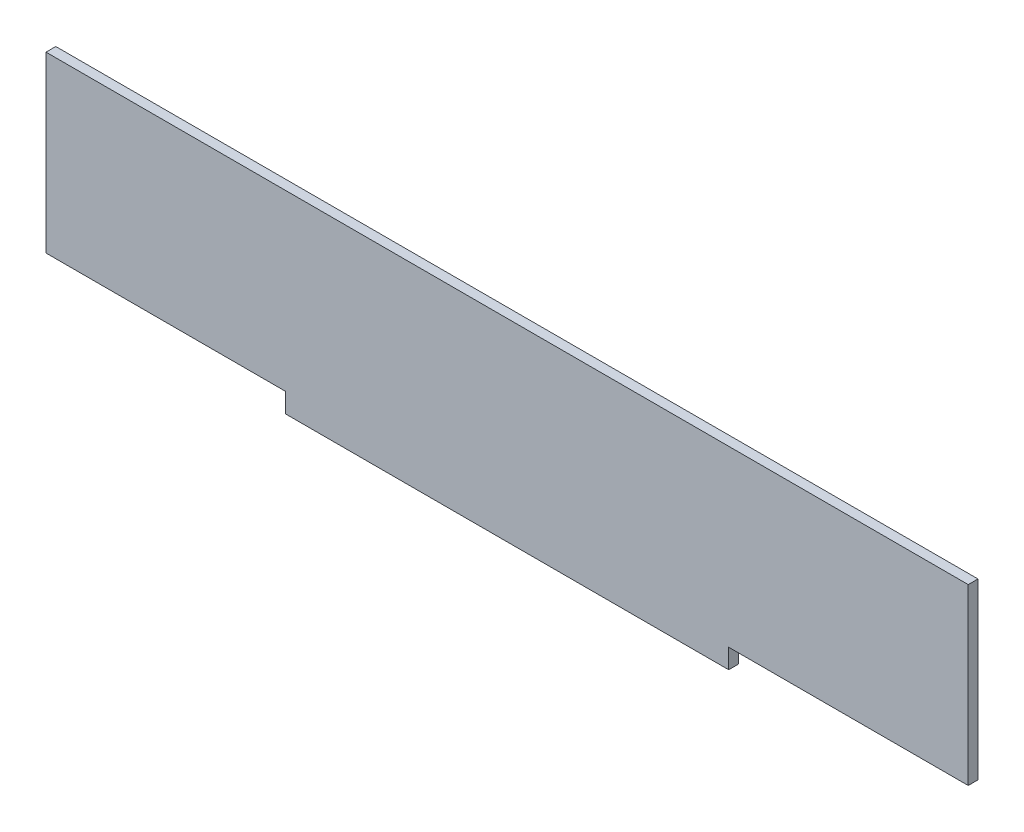
ISO-10303-21;
HEADER;
FILE_DESCRIPTION(('STEP AP214'),'2;1');
FILE_NAME('part.step','',(''),(''),'','','');
FILE_SCHEMA(('AUTOMOTIVE_DESIGN { 1 0 10303 214 1 1 1 1 }'));
ENDSEC;
DATA;
#1=APPLICATION_CONTEXT('core data for automotive mechanical design processes');
#2=APPLICATION_PROTOCOL_DEFINITION('international standard','automotive_design',2000,#1);
#3=PRODUCT_CONTEXT('',#1,'mechanical');
#4=PRODUCT('Part','Part','',(#3));
#5=PRODUCT_RELATED_PRODUCT_CATEGORY('part','',(#4));
#6=PRODUCT_DEFINITION_FORMATION('','',#4);
#7=PRODUCT_DEFINITION_CONTEXT('part definition',#1,'design');
#8=PRODUCT_DEFINITION('design','',#6,#7);
#9=PRODUCT_DEFINITION_SHAPE('','',#8);
#10=(LENGTH_UNIT() NAMED_UNIT(*) SI_UNIT(.MILLI.,.METRE.));
#11=(NAMED_UNIT(*) PLANE_ANGLE_UNIT() SI_UNIT($,.RADIAN.));
#12=(NAMED_UNIT(*) SI_UNIT($,.STERADIAN.) SOLID_ANGLE_UNIT());
#13=UNCERTAINTY_MEASURE_WITH_UNIT(LENGTH_MEASURE(1.E-05),#10,'distance_accuracy_value','');
#14=(GEOMETRIC_REPRESENTATION_CONTEXT(3) GLOBAL_UNCERTAINTY_ASSIGNED_CONTEXT((#13)) GLOBAL_UNIT_ASSIGNED_CONTEXT((#10,
#11,#12)) REPRESENTATION_CONTEXT('',''));
#15=CARTESIAN_POINT('',(0.,0.,0.));
#16=DIRECTION('',(0.,0.,1.));
#17=DIRECTION('',(1.,0.,0.));
#18=AXIS2_PLACEMENT_3D('',#15,#16,#17);
#19=CARTESIAN_POINT('',(-149.85,-28.275,3.175));
#20=DIRECTION('',(0.,1.,0.));
#21=DIRECTION('',(0.,0.,1.));
#22=AXIS2_PLACEMENT_3D('',#19,#20,#21);
#23=PLANE('',#22);
#24=DIRECTION('',(0.,0.,1.));
#25=VECTOR('',#24,1.);
#26=CARTESIAN_POINT('',(72.,-28.275,3.175));
#27=LINE('',#26,#25);
#28=CARTESIAN_POINT('',(72.,-28.275,0.));
#29=VERTEX_POINT('',#28);
#30=CARTESIAN_POINT('',(72.,-28.275,3.175));
#31=VERTEX_POINT('',#30);
#32=EDGE_CURVE('E131',#29,#31,#27,.T.);
#33=ORIENTED_EDGE('',*,*,#32,.F.);
#34=DIRECTION('',(1.,0.,0.));
#35=VECTOR('',#34,1.);
#36=CARTESIAN_POINT('',(-149.85,-28.275,0.));
#37=LINE('',#36,#35);
#38=CARTESIAN_POINT('',(149.85,-28.275,0.));
#39=VERTEX_POINT('',#38);
#40=EDGE_CURVE('E154',#29,#39,#37,.T.);
#41=ORIENTED_EDGE('',*,*,#40,.T.);
#42=DIRECTION('',(0.,0.,-1.));
#43=VECTOR('',#42,1.);
#44=CARTESIAN_POINT('',(149.85,-28.275,3.175));
#45=LINE('',#44,#43);
#46=CARTESIAN_POINT('',(149.85,-28.275,3.175));
#47=VERTEX_POINT('',#46);
#48=EDGE_CURVE('E149',#47,#39,#45,.T.);
#49=ORIENTED_EDGE('',*,*,#48,.F.);
#50=DIRECTION('',(1.,0.,0.));
#51=VECTOR('',#50,1.);
#52=CARTESIAN_POINT('',(-149.85,-28.275,3.175));
#53=LINE('',#52,#51);
#54=EDGE_CURVE('E58',#31,#47,#53,.T.);
#55=ORIENTED_EDGE('',*,*,#54,.F.);
#56=EDGE_LOOP('',(#33,#41,#49,#55));
#57=FACE_BOUND('',#56,.T.);
#58=ADVANCED_FACE('F43',(#57),#23,.F.);
#59=DIRECTION('',(0.,0.,-1.));
#60=VECTOR('',#59,1.);
#61=CARTESIAN_POINT('',(-72.,-28.275,3.175));
#62=LINE('',#61,#60);
#63=CARTESIAN_POINT('',(-72.,-28.275,3.175));
#64=VERTEX_POINT('',#63);
#65=CARTESIAN_POINT('',(-72.,-28.275,0.));
#66=VERTEX_POINT('',#65);
#67=EDGE_CURVE('E66',#64,#66,#62,.T.);
#68=ORIENTED_EDGE('',*,*,#67,.F.);
#69=CARTESIAN_POINT('',(-149.85,-28.275,3.175));
#70=VERTEX_POINT('',#69);
#71=EDGE_CURVE('E148',#70,#64,#53,.T.);
#72=ORIENTED_EDGE('',*,*,#71,.F.);
#73=DIRECTION('',(0.,0.,-1.));
#74=VECTOR('',#73,1.);
#75=CARTESIAN_POINT('',(-149.85,-28.275,3.175));
#76=LINE('',#75,#74);
#77=CARTESIAN_POINT('',(-149.85,-28.275,0.));
#78=VERTEX_POINT('',#77);
#79=EDGE_CURVE('E158',#70,#78,#76,.T.);
#80=ORIENTED_EDGE('',*,*,#79,.T.);
#81=EDGE_CURVE('E144',#78,#66,#37,.T.);
#82=ORIENTED_EDGE('',*,*,#81,.T.);
#83=EDGE_LOOP('',(#68,#72,#80,#82));
#84=FACE_BOUND('',#83,.T.);
#85=ADVANCED_FACE('F174',(#84),#23,.F.);
#86=CARTESIAN_POINT('',(149.85,28.275,3.175));
#87=DIRECTION('',(-1.,0.,0.));
#88=DIRECTION('',(0.,0.,1.));
#89=AXIS2_PLACEMENT_3D('',#86,#87,#88);
#90=PLANE('',#89);
#91=DIRECTION('',(0.,1.,0.));
#92=VECTOR('',#91,1.);
#93=CARTESIAN_POINT('',(149.85,28.275,0.));
#94=LINE('',#93,#92);
#95=CARTESIAN_POINT('',(149.85,28.275,0.));
#96=VERTEX_POINT('',#95);
#97=EDGE_CURVE('E132',#39,#96,#94,.T.);
#98=ORIENTED_EDGE('',*,*,#97,.T.);
#99=DIRECTION('',(0.,0.,-1.));
#100=VECTOR('',#99,1.);
#101=CARTESIAN_POINT('',(149.85,28.275,3.175));
#102=LINE('',#101,#100);
#103=CARTESIAN_POINT('',(149.85,28.275,3.175));
#104=VERTEX_POINT('',#103);
#105=EDGE_CURVE('E11',#104,#96,#102,.T.);
#106=ORIENTED_EDGE('',*,*,#105,.F.);
#107=DIRECTION('',(0.,1.,0.));
#108=VECTOR('',#107,1.);
#109=CARTESIAN_POINT('',(149.85,28.275,3.175));
#110=LINE('',#109,#108);
#111=EDGE_CURVE('E141',#47,#104,#110,.T.);
#112=ORIENTED_EDGE('',*,*,#111,.F.);
#113=ORIENTED_EDGE('',*,*,#48,.T.);
#114=EDGE_LOOP('',(#98,#106,#112,#113));
#115=FACE_BOUND('',#114,.T.);
#116=ADVANCED_FACE('F45',(#115),#90,.F.);
#117=CARTESIAN_POINT('',(-149.85,28.275,3.175));
#118=DIRECTION('',(0.,-1.,0.));
#119=DIRECTION('',(0.,0.,-1.));
#120=AXIS2_PLACEMENT_3D('',#117,#118,#119);
#121=PLANE('',#120);
#122=DIRECTION('',(-1.,0.,0.));
#123=VECTOR('',#122,1.);
#124=CARTESIAN_POINT('',(-149.85,28.275,0.));
#125=LINE('',#124,#123);
#126=CARTESIAN_POINT('',(-149.85,28.275,0.));
#127=VERTEX_POINT('',#126);
#128=EDGE_CURVE('E135',#96,#127,#125,.T.);
#129=ORIENTED_EDGE('',*,*,#128,.T.);
#130=DIRECTION('',(0.,0.,-1.));
#131=VECTOR('',#130,1.);
#132=CARTESIAN_POINT('',(-149.85,28.275,3.175));
#133=LINE('',#132,#131);
#134=CARTESIAN_POINT('',(-149.85,28.275,3.175));
#135=VERTEX_POINT('',#134);
#136=EDGE_CURVE('E51',#135,#127,#133,.T.);
#137=ORIENTED_EDGE('',*,*,#136,.F.);
#138=DIRECTION('',(-1.,0.,0.));
#139=VECTOR('',#138,1.);
#140=CARTESIAN_POINT('',(-149.85,28.275,3.175));
#141=LINE('',#140,#139);
#142=EDGE_CURVE('E143',#104,#135,#141,.T.);
#143=ORIENTED_EDGE('',*,*,#142,.F.);
#144=ORIENTED_EDGE('',*,*,#105,.T.);
#145=EDGE_LOOP('',(#129,#137,#143,#144));
#146=FACE_BOUND('',#145,.T.);
#147=ADVANCED_FACE('F187',(#146),#121,.F.);
#148=CARTESIAN_POINT('',(-149.85,28.275,3.175));
#149=DIRECTION('',(1.,0.,0.));
#150=DIRECTION('',(0.,0.,-1.));
#151=AXIS2_PLACEMENT_3D('',#148,#149,#150);
#152=PLANE('',#151);
#153=DIRECTION('',(0.,-1.,0.));
#154=VECTOR('',#153,1.);
#155=CARTESIAN_POINT('',(-149.85,28.275,0.));
#156=LINE('',#155,#154);
#157=EDGE_CURVE('E152',#127,#78,#156,.T.);
#158=ORIENTED_EDGE('',*,*,#157,.T.);
#159=ORIENTED_EDGE('',*,*,#79,.F.);
#160=DIRECTION('',(0.,-1.,0.));
#161=VECTOR('',#160,1.);
#162=CARTESIAN_POINT('',(-149.85,28.275,3.175));
#163=LINE('',#162,#161);
#164=EDGE_CURVE('E146',#135,#70,#163,.T.);
#165=ORIENTED_EDGE('',*,*,#164,.F.);
#166=ORIENTED_EDGE('',*,*,#136,.T.);
#167=EDGE_LOOP('',(#158,#159,#165,#166));
#168=FACE_BOUND('',#167,.T.);
#169=ADVANCED_FACE('F165',(#168),#152,.F.);
#170=CARTESIAN_POINT('',(0.,0.,3.175));
#171=DIRECTION('',(0.,0.,1.));
#172=DIRECTION('',(1.,0.,0.));
#173=AXIS2_PLACEMENT_3D('',#170,#171,#172);
#174=PLANE('',#173);
#175=ORIENTED_EDGE('',*,*,#111,.T.);
#176=ORIENTED_EDGE('',*,*,#142,.T.);
#177=ORIENTED_EDGE('',*,*,#164,.T.);
#178=ORIENTED_EDGE('',*,*,#71,.T.);
#179=DIRECTION('',(0.,1.,0.));
#180=VECTOR('',#179,1.);
#181=CARTESIAN_POINT('',(-72.,-34.625,3.175));
#182=LINE('',#181,#180);
#183=CARTESIAN_POINT('',(-72.,-34.625,3.175));
#184=VERTEX_POINT('',#183);
#185=EDGE_CURVE('E116',#184,#64,#182,.T.);
#186=ORIENTED_EDGE('',*,*,#185,.F.);
#187=DIRECTION('',(-1.,0.,0.));
#188=VECTOR('',#187,1.);
#189=CARTESIAN_POINT('',(-72.,-34.625,3.175));
#190=LINE('',#189,#188);
#191=CARTESIAN_POINT('',(72.,-34.625,3.175));
#192=VERTEX_POINT('',#191);
#193=EDGE_CURVE('E108',#192,#184,#190,.T.);
#194=ORIENTED_EDGE('',*,*,#193,.F.);
#195=DIRECTION('',(0.,1.,0.));
#196=VECTOR('',#195,1.);
#197=CARTESIAN_POINT('',(72.,-34.625,3.175));
#198=LINE('',#197,#196);
#199=EDGE_CURVE('E113',#192,#31,#198,.T.);
#200=ORIENTED_EDGE('',*,*,#199,.T.);
#201=ORIENTED_EDGE('',*,*,#54,.T.);
#202=EDGE_LOOP('',(#175,#176,#177,#178,#186,#194,#200,#201));
#203=FACE_BOUND('',#202,.T.);
#204=ADVANCED_FACE('F111',(#203),#174,.T.);
#205=CARTESIAN_POINT('',(0.,0.,0.));
#206=DIRECTION('',(0.,0.,1.));
#207=DIRECTION('',(1.,0.,0.));
#208=AXIS2_PLACEMENT_3D('',#205,#206,#207);
#209=PLANE('',#208);
#210=ORIENTED_EDGE('',*,*,#97,.F.);
#211=ORIENTED_EDGE('',*,*,#40,.F.);
#212=DIRECTION('',(0.,1.,0.));
#213=VECTOR('',#212,1.);
#214=CARTESIAN_POINT('',(72.,-34.625,0.));
#215=LINE('',#214,#213);
#216=CARTESIAN_POINT('',(72.,-34.625,0.));
#217=VERTEX_POINT('',#216);
#218=EDGE_CURVE('E181',#217,#29,#215,.T.);
#219=ORIENTED_EDGE('',*,*,#218,.F.);
#220=DIRECTION('',(1.,0.,0.));
#221=VECTOR('',#220,1.);
#222=CARTESIAN_POINT('',(-72.,-34.625,0.));
#223=LINE('',#222,#221);
#224=CARTESIAN_POINT('',(-72.,-34.625,0.));
#225=VERTEX_POINT('',#224);
#226=EDGE_CURVE('E125',#225,#217,#223,.T.);
#227=ORIENTED_EDGE('',*,*,#226,.F.);
#228=DIRECTION('',(0.,1.,0.));
#229=VECTOR('',#228,1.);
#230=CARTESIAN_POINT('',(-72.,-34.625,0.));
#231=LINE('',#230,#229);
#232=EDGE_CURVE('E137',#225,#66,#231,.T.);
#233=ORIENTED_EDGE('',*,*,#232,.T.);
#234=ORIENTED_EDGE('',*,*,#81,.F.);
#235=ORIENTED_EDGE('',*,*,#157,.F.);
#236=ORIENTED_EDGE('',*,*,#128,.F.);
#237=EDGE_LOOP('',(#210,#211,#219,#227,#233,#234,#235,#236));
#238=FACE_BOUND('',#237,.T.);
#239=ADVANCED_FACE('F171',(#238),#209,.F.);
#240=CARTESIAN_POINT('',(72.,-34.625,3.175));
#241=DIRECTION('',(-1.,0.,0.));
#242=DIRECTION('',(0.,0.,1.));
#243=AXIS2_PLACEMENT_3D('',#240,#241,#242);
#244=PLANE('',#243);
#245=ORIENTED_EDGE('',*,*,#32,.T.);
#246=ORIENTED_EDGE('',*,*,#199,.F.);
#247=DIRECTION('',(0.,0.,1.));
#248=VECTOR('',#247,1.);
#249=CARTESIAN_POINT('',(72.,-34.625,3.175));
#250=LINE('',#249,#248);
#251=EDGE_CURVE('E120',#217,#192,#250,.T.);
#252=ORIENTED_EDGE('',*,*,#251,.F.);
#253=ORIENTED_EDGE('',*,*,#218,.T.);
#254=EDGE_LOOP('',(#245,#246,#252,#253));
#255=FACE_BOUND('',#254,.T.);
#256=ADVANCED_FACE('F130',(#255),#244,.F.);
#257=CARTESIAN_POINT('',(-72.,-34.625,3.175));
#258=DIRECTION('',(1.,0.,0.));
#259=DIRECTION('',(0.,0.,-1.));
#260=AXIS2_PLACEMENT_3D('',#257,#258,#259);
#261=PLANE('',#260);
#262=ORIENTED_EDGE('',*,*,#67,.T.);
#263=ORIENTED_EDGE('',*,*,#232,.F.);
#264=DIRECTION('',(0.,0.,-1.));
#265=VECTOR('',#264,1.);
#266=CARTESIAN_POINT('',(-72.,-34.625,3.175));
#267=LINE('',#266,#265);
#268=EDGE_CURVE('E119',#184,#225,#267,.T.);
#269=ORIENTED_EDGE('',*,*,#268,.F.);
#270=ORIENTED_EDGE('',*,*,#185,.T.);
#271=EDGE_LOOP('',(#262,#263,#269,#270));
#272=FACE_BOUND('',#271,.T.);
#273=ADVANCED_FACE('F176',(#272),#261,.F.);
#274=CARTESIAN_POINT('',(0.,-34.625,0.));
#275=DIRECTION('',(0.,-1.,0.));
#276=DIRECTION('',(0.,0.,-1.));
#277=AXIS2_PLACEMENT_3D('',#274,#275,#276);
#278=PLANE('',#277);
#279=ORIENTED_EDGE('',*,*,#251,.T.);
#280=ORIENTED_EDGE('',*,*,#193,.T.);
#281=ORIENTED_EDGE('',*,*,#268,.T.);
#282=ORIENTED_EDGE('',*,*,#226,.T.);
#283=EDGE_LOOP('',(#279,#280,#281,#282));
#284=FACE_BOUND('',#283,.T.);
#285=ADVANCED_FACE('F123',(#284),#278,.T.);
#286=CLOSED_SHELL('',(#58,#85,#116,#147,#169,#204,#239,#256,#273,#285));
#287=MANIFOLD_SOLID_BREP('B2',#286);
#288=ADVANCED_BREP_SHAPE_REPRESENTATION('',(#18,#287),#14);
#289=SHAPE_DEFINITION_REPRESENTATION(#9,#288);
ENDSEC;
END-ISO-10303-21;
